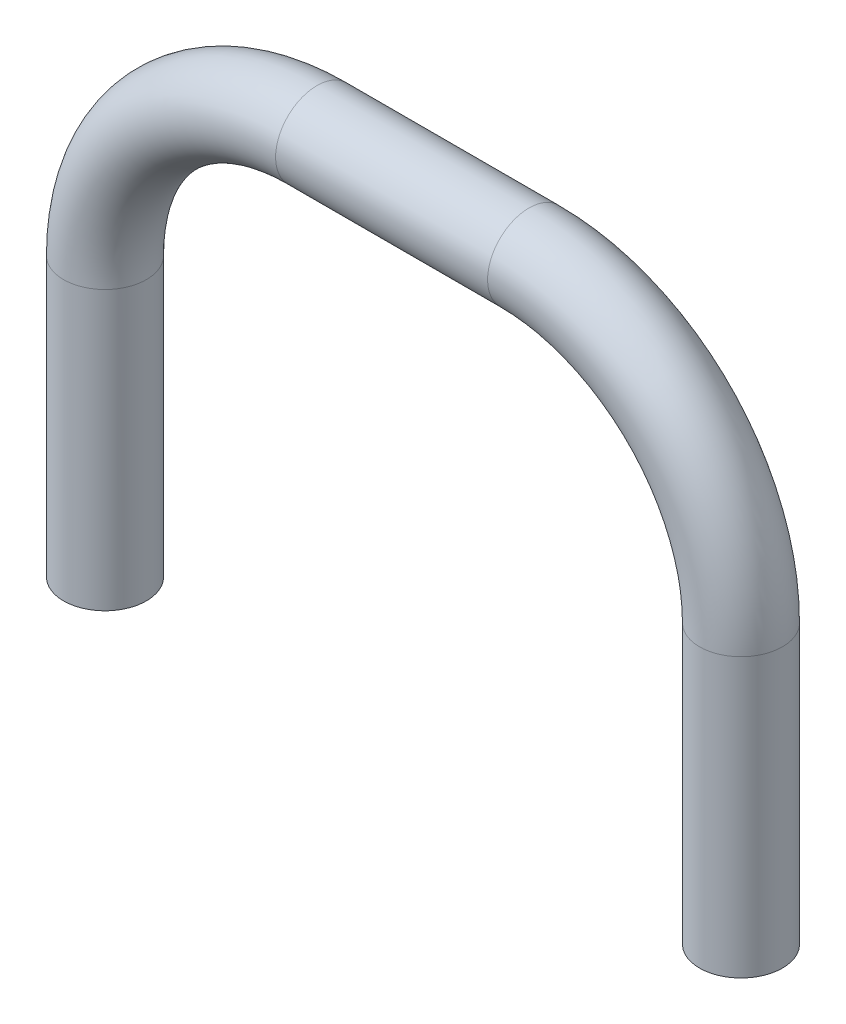
ISO-10303-21;
HEADER;
FILE_DESCRIPTION(('STEP AP214'),'2;1');
FILE_NAME('part.step','',(''),(''),'','','');
FILE_SCHEMA(('AUTOMOTIVE_DESIGN { 1 0 10303 214 1 1 1 1 }'));
ENDSEC;
DATA;
#1=APPLICATION_CONTEXT('core data for automotive mechanical design processes');
#2=APPLICATION_PROTOCOL_DEFINITION('international standard','automotive_design',2000,#1);
#3=PRODUCT_CONTEXT('',#1,'mechanical');
#4=PRODUCT('Part','Part','',(#3));
#5=PRODUCT_RELATED_PRODUCT_CATEGORY('part','',(#4));
#6=PRODUCT_DEFINITION_FORMATION('','',#4);
#7=PRODUCT_DEFINITION_CONTEXT('part definition',#1,'design');
#8=PRODUCT_DEFINITION('design','',#6,#7);
#9=PRODUCT_DEFINITION_SHAPE('','',#8);
#10=(LENGTH_UNIT() NAMED_UNIT(*) SI_UNIT(.MILLI.,.METRE.));
#11=(NAMED_UNIT(*) PLANE_ANGLE_UNIT() SI_UNIT($,.RADIAN.));
#12=(NAMED_UNIT(*) SI_UNIT($,.STERADIAN.) SOLID_ANGLE_UNIT());
#13=UNCERTAINTY_MEASURE_WITH_UNIT(LENGTH_MEASURE(1.E-05),#10,'distance_accuracy_value','');
#14=(GEOMETRIC_REPRESENTATION_CONTEXT(3) GLOBAL_UNCERTAINTY_ASSIGNED_CONTEXT((#13)) GLOBAL_UNIT_ASSIGNED_CONTEXT((#10,
#11,#12)) REPRESENTATION_CONTEXT('',''));
#15=CARTESIAN_POINT('',(0.,0.,0.));
#16=DIRECTION('',(0.,0.,1.));
#17=DIRECTION('',(1.,0.,0.));
#18=AXIS2_PLACEMENT_3D('',#15,#16,#17);
#19=CARTESIAN_POINT('',(609.6,266.7,0.));
#20=DIRECTION('',(0.,-1.,0.));
#21=DIRECTION('',(1.,0.,0.));
#22=AXIS2_PLACEMENT_3D('',#19,#20,#21);
#23=CYLINDRICAL_SURFACE('',#22,39.6875);
#24=CARTESIAN_POINT('',(609.6,266.7,0.));
#25=DIRECTION('',(0.,-1.,0.));
#26=DIRECTION('',(0.,0.,1.));
#27=AXIS2_PLACEMENT_3D('',#24,#25,#26);
#28=CIRCLE('',#27,39.6875);
#29=CARTESIAN_POINT('',(649.2875,266.7,0.));
#30=VERTEX_POINT('',#29);
#31=EDGE_CURVE('E38',#30,#30,#28,.T.);
#32=ORIENTED_EDGE('',*,*,#31,.T.);
#33=EDGE_LOOP('',(#32));
#34=FACE_BOUND('',#33,.T.);
#35=CARTESIAN_POINT('',(609.6,0.,0.));
#36=DIRECTION('',(0.,-1.,0.));
#37=DIRECTION('',(0.,0.,1.));
#38=AXIS2_PLACEMENT_3D('',#35,#36,#37);
#39=CIRCLE('',#38,39.6875);
#40=CARTESIAN_POINT('',(609.6,0.,39.6875));
#41=VERTEX_POINT('',#40);
#42=EDGE_CURVE('E10',#41,#41,#39,.T.);
#43=ORIENTED_EDGE('',*,*,#42,.F.);
#44=EDGE_LOOP('',(#43));
#45=FACE_BOUND('',#44,.T.);
#46=ADVANCED_FACE('F32',(#34,#45),#23,.T.);
#47=CARTESIAN_POINT('',(406.4,266.7,0.));
#48=DIRECTION('',(0.,0.,-1.));
#49=DIRECTION('',(-1.,0.,0.));
#50=AXIS2_PLACEMENT_3D('',#47,#48,#49);
#51=TOROIDAL_SURFACE('',#50,203.2,39.6875);
#52=CARTESIAN_POINT('',(406.4,469.9,0.));
#53=DIRECTION('',(1.,0.,0.));
#54=DIRECTION('',(0.,0.,1.));
#55=AXIS2_PLACEMENT_3D('',#52,#53,#54);
#56=CIRCLE('',#55,39.6875);
#57=CARTESIAN_POINT('',(406.4,509.5875,0.));
#58=VERTEX_POINT('',#57);
#59=EDGE_CURVE('E42',#58,#58,#56,.T.);
#60=CARTESIAN_POINT('',(406.4,266.7,0.));
#61=DIRECTION('',(0.,0.,-1.));
#62=DIRECTION('',(-1.,0.,0.));
#63=AXIS2_PLACEMENT_3D('',#60,#61,#62);
#64=CIRCLE('',#63,242.8875);
#65=EDGE_CURVE('',#58,#30,#64,.T.);
#66=ORIENTED_EDGE('',*,*,#59,.T.);
#67=ORIENTED_EDGE('',*,*,#31,.F.);
#68=ORIENTED_EDGE('',*,*,#65,.T.);
#69=ORIENTED_EDGE('',*,*,#65,.F.);
#70=EDGE_LOOP('',(#66,#68,#67,#69));
#71=FACE_BOUND('',#70,.T.);
#72=ADVANCED_FACE('F88',(#71),#51,.T.);
#73=CARTESIAN_POINT('',(203.2,469.9,0.));
#74=DIRECTION('',(1.,0.,0.));
#75=DIRECTION('',(0.,0.,-1.));
#76=AXIS2_PLACEMENT_3D('',#73,#74,#75);
#77=CYLINDRICAL_SURFACE('',#76,39.6875);
#78=CARTESIAN_POINT('',(203.2,469.9,0.));
#79=DIRECTION('',(1.,0.,0.));
#80=DIRECTION('',(0.,0.,1.));
#81=AXIS2_PLACEMENT_3D('',#78,#79,#80);
#82=CIRCLE('',#81,39.6875);
#83=CARTESIAN_POINT('',(203.2,509.5875,0.));
#84=VERTEX_POINT('',#83);
#85=EDGE_CURVE('E46',#84,#84,#82,.T.);
#86=ORIENTED_EDGE('',*,*,#85,.T.);
#87=EDGE_LOOP('',(#86));
#88=FACE_BOUND('',#87,.T.);
#89=ORIENTED_EDGE('',*,*,#59,.F.);
#90=EDGE_LOOP('',(#89));
#91=FACE_BOUND('',#90,.T.);
#92=ADVANCED_FACE('F92',(#88,#91),#77,.T.);
#93=CARTESIAN_POINT('',(203.2,266.7,0.));
#94=DIRECTION('',(0.,0.,-1.));
#95=DIRECTION('',(-1.,0.,0.));
#96=AXIS2_PLACEMENT_3D('',#93,#94,#95);
#97=TOROIDAL_SURFACE('',#96,203.2,39.6875);
#98=CARTESIAN_POINT('',(0.,266.7,0.));
#99=DIRECTION('',(0.,1.,0.));
#100=DIRECTION('',(0.,0.,1.));
#101=AXIS2_PLACEMENT_3D('',#98,#99,#100);
#102=CIRCLE('',#101,39.6875);
#103=CARTESIAN_POINT('',(-39.6875,266.7,0.));
#104=VERTEX_POINT('',#103);
#105=EDGE_CURVE('E51',#104,#104,#102,.T.);
#106=CARTESIAN_POINT('',(203.2,266.7,0.));
#107=DIRECTION('',(0.,0.,-1.));
#108=DIRECTION('',(-1.,0.,0.));
#109=AXIS2_PLACEMENT_3D('',#106,#107,#108);
#110=CIRCLE('',#109,242.8875);
#111=EDGE_CURVE('',#104,#84,#110,.T.);
#112=ORIENTED_EDGE('',*,*,#105,.T.);
#113=ORIENTED_EDGE('',*,*,#85,.F.);
#114=ORIENTED_EDGE('',*,*,#111,.T.);
#115=ORIENTED_EDGE('',*,*,#111,.F.);
#116=EDGE_LOOP('',(#112,#114,#113,#115));
#117=FACE_BOUND('',#116,.T.);
#118=ADVANCED_FACE('F84',(#117),#97,.T.);
#119=CARTESIAN_POINT('',(0.,266.7,0.));
#120=DIRECTION('',(0.,-1.,0.));
#121=DIRECTION('',(0.,0.,-1.));
#122=AXIS2_PLACEMENT_3D('',#119,#120,#121);
#123=CYLINDRICAL_SURFACE('',#122,39.6875);
#124=ORIENTED_EDGE('',*,*,#105,.F.);
#125=EDGE_LOOP('',(#124));
#126=FACE_BOUND('',#125,.T.);
#127=CARTESIAN_POINT('',(0.,0.,0.));
#128=DIRECTION('',(0.,1.,0.));
#129=DIRECTION('',(0.,0.,1.));
#130=AXIS2_PLACEMENT_3D('',#127,#128,#129);
#131=CIRCLE('',#130,39.6875);
#132=CARTESIAN_POINT('',(0.,0.,39.6875));
#133=VERTEX_POINT('',#132);
#134=EDGE_CURVE('E54',#133,#133,#131,.T.);
#135=ORIENTED_EDGE('',*,*,#134,.T.);
#136=EDGE_LOOP('',(#135));
#137=FACE_BOUND('',#136,.T.);
#138=ADVANCED_FACE('F75',(#126,#137),#123,.T.);
#139=CARTESIAN_POINT('',(609.6,0.,0.));
#140=DIRECTION('',(0.,-1.,0.));
#141=DIRECTION('',(0.,0.,1.));
#142=AXIS2_PLACEMENT_3D('',#139,#140,#141);
#143=PLANE('',#142);
#144=CARTESIAN_POINT('',(609.6,0.,0.));
#145=DIRECTION('',(0.,-1.,0.));
#146=DIRECTION('',(1.,0.,0.));
#147=AXIS2_PLACEMENT_3D('',#144,#145,#146);
#148=CIRCLE('',#147,38.1);
#149=CARTESIAN_POINT('',(647.7,0.,0.));
#150=VERTEX_POINT('',#149);
#151=EDGE_CURVE('E66',#150,#150,#148,.T.);
#152=ORIENTED_EDGE('',*,*,#151,.F.);
#153=EDGE_LOOP('',(#152));
#154=FACE_BOUND('',#153,.T.);
#155=ORIENTED_EDGE('',*,*,#42,.T.);
#156=EDGE_LOOP('',(#155));
#157=FACE_BOUND('',#156,.T.);
#158=ADVANCED_FACE('F72',(#154,#157),#143,.T.);
#159=CARTESIAN_POINT('',(0.,0.,0.));
#160=DIRECTION('',(0.,1.,0.));
#161=DIRECTION('',(0.,0.,1.));
#162=AXIS2_PLACEMENT_3D('',#159,#160,#161);
#163=PLANE('',#162);
#164=CARTESIAN_POINT('',(0.,0.,0.));
#165=DIRECTION('',(0.,-1.,0.));
#166=DIRECTION('',(0.,0.,-1.));
#167=AXIS2_PLACEMENT_3D('',#164,#165,#166);
#168=CIRCLE('',#167,38.1);
#169=CARTESIAN_POINT('',(0.,0.,-38.1));
#170=VERTEX_POINT('',#169);
#171=EDGE_CURVE('E60',#170,#170,#168,.T.);
#172=ORIENTED_EDGE('',*,*,#171,.F.);
#173=EDGE_LOOP('',(#172));
#174=FACE_BOUND('',#173,.T.);
#175=ORIENTED_EDGE('',*,*,#134,.F.);
#176=EDGE_LOOP('',(#175));
#177=FACE_BOUND('',#176,.T.);
#178=ADVANCED_FACE('F74',(#174,#177),#163,.F.);
#179=CARTESIAN_POINT('',(0.,256.539999999999,0.));
#180=DIRECTION('',(0.,-1.,0.));
#181=DIRECTION('',(0.,0.,-1.));
#182=AXIS2_PLACEMENT_3D('',#179,#180,#181);
#183=CYLINDRICAL_SURFACE('',#182,38.1);
#184=CARTESIAN_POINT('',(0.,256.539999999999,0.));
#185=DIRECTION('',(0.,-1.,0.));
#186=DIRECTION('',(0.,0.,-1.));
#187=AXIS2_PLACEMENT_3D('',#184,#185,#186);
#188=CIRCLE('',#187,38.1);
#189=CARTESIAN_POINT('',(0.,256.539999999999,-38.1));
#190=VERTEX_POINT('',#189);
#191=EDGE_CURVE('E57',#190,#190,#188,.T.);
#192=ORIENTED_EDGE('',*,*,#191,.F.);
#193=EDGE_LOOP('',(#192));
#194=FACE_BOUND('',#193,.T.);
#195=ORIENTED_EDGE('',*,*,#171,.T.);
#196=EDGE_LOOP('',(#195));
#197=FACE_BOUND('',#196,.T.);
#198=ADVANCED_FACE('F81',(#194,#197),#183,.F.);
#199=CARTESIAN_POINT('',(0.,256.539999999999,0.));
#200=DIRECTION('',(0.,-1.,0.));
#201=DIRECTION('',(0.,0.,-1.));
#202=AXIS2_PLACEMENT_3D('',#199,#200,#201);
#203=PLANE('',#202);
#204=ORIENTED_EDGE('',*,*,#191,.T.);
#205=EDGE_LOOP('',(#204));
#206=FACE_BOUND('',#205,.T.);
#207=ADVANCED_FACE('F130',(#206),#203,.T.);
#208=CARTESIAN_POINT('',(609.6,261.62,0.));
#209=DIRECTION('',(0.,-1.,0.));
#210=DIRECTION('',(1.,0.,0.));
#211=AXIS2_PLACEMENT_3D('',#208,#209,#210);
#212=CYLINDRICAL_SURFACE('',#211,38.1);
#213=CARTESIAN_POINT('',(609.6,261.62,0.));
#214=DIRECTION('',(0.,-1.,0.));
#215=DIRECTION('',(1.,0.,0.));
#216=AXIS2_PLACEMENT_3D('',#213,#214,#215);
#217=CIRCLE('',#216,38.1);
#218=CARTESIAN_POINT('',(647.7,261.62,0.));
#219=VERTEX_POINT('',#218);
#220=EDGE_CURVE('E63',#219,#219,#217,.T.);
#221=ORIENTED_EDGE('',*,*,#220,.F.);
#222=EDGE_LOOP('',(#221));
#223=FACE_BOUND('',#222,.T.);
#224=ORIENTED_EDGE('',*,*,#151,.T.);
#225=EDGE_LOOP('',(#224));
#226=FACE_BOUND('',#225,.T.);
#227=ADVANCED_FACE('F70',(#223,#226),#212,.F.);
#228=CARTESIAN_POINT('',(609.6,261.62,0.));
#229=DIRECTION('',(0.,-1.,0.));
#230=DIRECTION('',(1.,0.,0.));
#231=AXIS2_PLACEMENT_3D('',#228,#229,#230);
#232=PLANE('',#231);
#233=ORIENTED_EDGE('',*,*,#220,.T.);
#234=EDGE_LOOP('',(#233));
#235=FACE_BOUND('',#234,.T.);
#236=ADVANCED_FACE('F147',(#235),#232,.T.);
#237=CLOSED_SHELL('',(#46,#72,#92,#118,#138,#158,#178,#198,#207,#227,#236));
#238=MANIFOLD_SOLID_BREP('B2',#237);
#239=ADVANCED_BREP_SHAPE_REPRESENTATION('',(#18,#238),#14);
#240=SHAPE_DEFINITION_REPRESENTATION(#9,#239);
ENDSEC;
END-ISO-10303-21;
